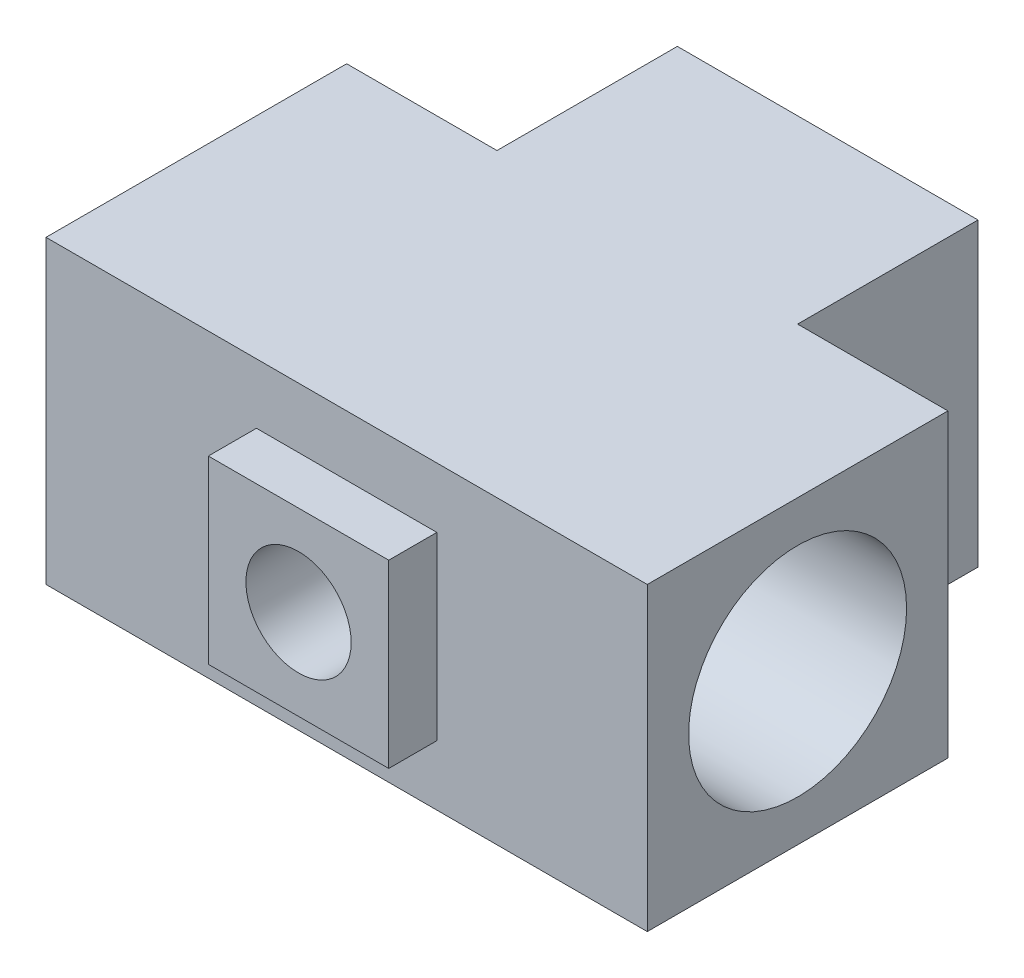
ISO-10303-21;
HEADER;
FILE_DESCRIPTION(('STEP AP214'),'2;1');
FILE_NAME('part.step','',(''),(''),'','','');
FILE_SCHEMA(('AUTOMOTIVE_DESIGN { 1 0 10303 214 1 1 1 1 }'));
ENDSEC;
DATA;
#1=APPLICATION_CONTEXT('core data for automotive mechanical design processes');
#2=APPLICATION_PROTOCOL_DEFINITION('international standard','automotive_design',2000,#1);
#3=PRODUCT_CONTEXT('',#1,'mechanical');
#4=PRODUCT('Part','Part','',(#3));
#5=PRODUCT_RELATED_PRODUCT_CATEGORY('part','',(#4));
#6=PRODUCT_DEFINITION_FORMATION('','',#4);
#7=PRODUCT_DEFINITION_CONTEXT('part definition',#1,'design');
#8=PRODUCT_DEFINITION('design','',#6,#7);
#9=PRODUCT_DEFINITION_SHAPE('','',#8);
#10=(LENGTH_UNIT() NAMED_UNIT(*) SI_UNIT(.MILLI.,.METRE.));
#11=(NAMED_UNIT(*) PLANE_ANGLE_UNIT() SI_UNIT($,.RADIAN.));
#12=(NAMED_UNIT(*) SI_UNIT($,.STERADIAN.) SOLID_ANGLE_UNIT());
#13=UNCERTAINTY_MEASURE_WITH_UNIT(LENGTH_MEASURE(1.E-05),#10,'distance_accuracy_value','');
#14=(GEOMETRIC_REPRESENTATION_CONTEXT(3) GLOBAL_UNCERTAINTY_ASSIGNED_CONTEXT((#13)) GLOBAL_UNIT_ASSIGNED_CONTEXT((#10,
#11,#12)) REPRESENTATION_CONTEXT('',''));
#15=CARTESIAN_POINT('',(0.,0.,0.));
#16=DIRECTION('',(0.,0.,1.));
#17=DIRECTION('',(1.,0.,0.));
#18=AXIS2_PLACEMENT_3D('',#15,#16,#17);
#19=CARTESIAN_POINT('',(0.,31.75,15.875));
#20=DIRECTION('',(0.,0.,-1.));
#21=DIRECTION('',(-1.,0.,0.));
#22=AXIS2_PLACEMENT_3D('',#19,#20,#21);
#23=PLANE('',#22);
#24=DIRECTION('',(1.,0.,0.));
#25=VECTOR('',#24,1.);
#26=CARTESIAN_POINT('',(0.,0.,15.875));
#27=LINE('',#26,#25);
#28=CARTESIAN_POINT('',(-31.75,0.,15.875));
#29=VERTEX_POINT('',#28);
#30=CARTESIAN_POINT('',(31.75,0.,15.875));
#31=VERTEX_POINT('',#30);
#32=EDGE_CURVE('E200',#29,#31,#27,.T.);
#33=ORIENTED_EDGE('',*,*,#32,.T.);
#34=DIRECTION('',(0.,-1.,0.));
#35=VECTOR('',#34,1.);
#36=CARTESIAN_POINT('',(31.75,31.75,15.875));
#37=LINE('',#36,#35);
#38=CARTESIAN_POINT('',(31.75,31.75,15.875));
#39=VERTEX_POINT('',#38);
#40=EDGE_CURVE('E277',#39,#31,#37,.T.);
#41=ORIENTED_EDGE('',*,*,#40,.F.);
#42=DIRECTION('',(1.,0.,0.));
#43=VECTOR('',#42,1.);
#44=CARTESIAN_POINT('',(0.,31.75,15.875));
#45=LINE('',#44,#43);
#46=CARTESIAN_POINT('',(-31.75,31.75,15.875));
#47=VERTEX_POINT('',#46);
#48=EDGE_CURVE('E201',#47,#39,#45,.T.);
#49=ORIENTED_EDGE('',*,*,#48,.F.);
#50=DIRECTION('',(0.,-1.,0.));
#51=VECTOR('',#50,1.);
#52=CARTESIAN_POINT('',(-31.75,31.75,15.875));
#53=LINE('',#52,#51);
#54=EDGE_CURVE('E229',#47,#29,#53,.T.);
#55=ORIENTED_EDGE('',*,*,#54,.T.);
#56=EDGE_LOOP('',(#33,#41,#49,#55));
#57=FACE_BOUND('',#56,.T.);
#58=DIRECTION('',(1.,0.,0.));
#59=VECTOR('',#58,1.);
#60=CARTESIAN_POINT('',(0.,6.35,15.875));
#61=LINE('',#60,#59);
#62=CARTESIAN_POINT('',(-9.525,6.35,15.875));
#63=VERTEX_POINT('',#62);
#64=CARTESIAN_POINT('',(9.525,6.35,15.875));
#65=VERTEX_POINT('',#64);
#66=EDGE_CURVE('E68',#63,#65,#61,.T.);
#67=ORIENTED_EDGE('',*,*,#66,.F.);
#68=DIRECTION('',(0.,1.,0.));
#69=VECTOR('',#68,1.);
#70=CARTESIAN_POINT('',(-9.525,0.,15.875));
#71=LINE('',#70,#69);
#72=CARTESIAN_POINT('',(-9.525,25.4,15.875));
#73=VERTEX_POINT('',#72);
#74=EDGE_CURVE('E73',#63,#73,#71,.T.);
#75=ORIENTED_EDGE('',*,*,#74,.T.);
#76=DIRECTION('',(1.,0.,0.));
#77=VECTOR('',#76,1.);
#78=CARTESIAN_POINT('',(0.,25.4,15.875));
#79=LINE('',#78,#77);
#80=CARTESIAN_POINT('',(9.525,25.4,15.875));
#81=VERTEX_POINT('',#80);
#82=EDGE_CURVE('E410',#73,#81,#79,.T.);
#83=ORIENTED_EDGE('',*,*,#82,.T.);
#84=DIRECTION('',(0.,1.,0.));
#85=VECTOR('',#84,1.);
#86=CARTESIAN_POINT('',(9.525,0.,15.875));
#87=LINE('',#86,#85);
#88=EDGE_CURVE('E396',#65,#81,#87,.T.);
#89=ORIENTED_EDGE('',*,*,#88,.F.);
#90=EDGE_LOOP('',(#67,#75,#83,#89));
#91=FACE_BOUND('',#90,.T.);
#92=ADVANCED_FACE('F47',(#57,#91),#23,.F.);
#93=CARTESIAN_POINT('',(31.75,31.75,0.));
#94=DIRECTION('',(-1.,0.,0.));
#95=DIRECTION('',(0.,0.,1.));
#96=AXIS2_PLACEMENT_3D('',#93,#94,#95);
#97=PLANE('',#96);
#98=CARTESIAN_POINT('',(31.75,15.875,0.));
#99=DIRECTION('',(1.,0.,0.));
#100=DIRECTION('',(0.,0.,-1.));
#101=AXIS2_PLACEMENT_3D('',#98,#99,#100);
#102=CIRCLE('',#101,11.509375);
#103=CARTESIAN_POINT('',(31.75,15.875,-11.509375));
#104=VERTEX_POINT('',#103);
#105=EDGE_CURVE('E192',#104,#104,#102,.T.);
#106=ORIENTED_EDGE('',*,*,#105,.F.);
#107=EDGE_LOOP('',(#106));
#108=FACE_BOUND('',#107,.T.);
#109=DIRECTION('',(0.,0.,-1.));
#110=VECTOR('',#109,1.);
#111=CARTESIAN_POINT('',(31.75,0.,0.));
#112=LINE('',#111,#110);
#113=CARTESIAN_POINT('',(31.75,0.,-15.875));
#114=VERTEX_POINT('',#113);
#115=EDGE_CURVE('E233',#31,#114,#112,.T.);
#116=ORIENTED_EDGE('',*,*,#115,.T.);
#117=DIRECTION('',(0.,-1.,0.));
#118=VECTOR('',#117,1.);
#119=CARTESIAN_POINT('',(31.75,31.75,-15.875));
#120=LINE('',#119,#118);
#121=CARTESIAN_POINT('',(31.75,31.75,-15.875));
#122=VERTEX_POINT('',#121);
#123=EDGE_CURVE('E274',#122,#114,#120,.T.);
#124=ORIENTED_EDGE('',*,*,#123,.F.);
#125=DIRECTION('',(0.,0.,-1.));
#126=VECTOR('',#125,1.);
#127=CARTESIAN_POINT('',(31.75,31.75,0.));
#128=LINE('',#127,#126);
#129=EDGE_CURVE('E205',#39,#122,#128,.T.);
#130=ORIENTED_EDGE('',*,*,#129,.F.);
#131=ORIENTED_EDGE('',*,*,#40,.T.);
#132=EDGE_LOOP('',(#116,#124,#130,#131));
#133=FACE_BOUND('',#132,.T.);
#134=ADVANCED_FACE('F344',(#108,#133),#97,.F.);
#135=CARTESIAN_POINT('',(0.,31.75,-15.875));
#136=DIRECTION('',(0.,0.,-1.));
#137=DIRECTION('',(-1.,0.,0.));
#138=AXIS2_PLACEMENT_3D('',#135,#136,#137);
#139=PLANE('',#138);
#140=DIRECTION('',(1.,0.,0.));
#141=VECTOR('',#140,1.);
#142=CARTESIAN_POINT('',(0.,0.,-15.875));
#143=LINE('',#142,#141);
#144=CARTESIAN_POINT('',(15.875,0.,-15.875));
#145=VERTEX_POINT('',#144);
#146=EDGE_CURVE('E237',#145,#114,#143,.T.);
#147=ORIENTED_EDGE('',*,*,#146,.F.);
#148=DIRECTION('',(0.,-1.,0.));
#149=VECTOR('',#148,1.);
#150=CARTESIAN_POINT('',(15.875,31.75,-15.875));
#151=LINE('',#150,#149);
#152=CARTESIAN_POINT('',(15.875,31.75,-15.875));
#153=VERTEX_POINT('',#152);
#154=EDGE_CURVE('E271',#153,#145,#151,.T.);
#155=ORIENTED_EDGE('',*,*,#154,.F.);
#156=DIRECTION('',(1.,0.,0.));
#157=VECTOR('',#156,1.);
#158=CARTESIAN_POINT('',(0.,31.75,-15.875));
#159=LINE('',#158,#157);
#160=EDGE_CURVE('E209',#153,#122,#159,.T.);
#161=ORIENTED_EDGE('',*,*,#160,.T.);
#162=ORIENTED_EDGE('',*,*,#123,.T.);
#163=EDGE_LOOP('',(#147,#155,#161,#162));
#164=FACE_BOUND('',#163,.T.);
#165=ADVANCED_FACE('F347',(#164),#139,.T.);
#166=CARTESIAN_POINT('',(15.875,31.75,0.));
#167=DIRECTION('',(-1.,0.,0.));
#168=DIRECTION('',(0.,0.,1.));
#169=AXIS2_PLACEMENT_3D('',#166,#167,#168);
#170=PLANE('',#169);
#171=DIRECTION('',(0.,0.,-1.));
#172=VECTOR('',#171,1.);
#173=CARTESIAN_POINT('',(15.875,0.,0.));
#174=LINE('',#173,#172);
#175=CARTESIAN_POINT('',(15.875,0.,-34.925));
#176=VERTEX_POINT('',#175);
#177=EDGE_CURVE('E241',#145,#176,#174,.T.);
#178=ORIENTED_EDGE('',*,*,#177,.T.);
#179=DIRECTION('',(0.,-1.,0.));
#180=VECTOR('',#179,1.);
#181=CARTESIAN_POINT('',(15.875,31.75,-34.925));
#182=LINE('',#181,#180);
#183=CARTESIAN_POINT('',(15.875,31.75,-34.925));
#184=VERTEX_POINT('',#183);
#185=EDGE_CURVE('E268',#184,#176,#182,.T.);
#186=ORIENTED_EDGE('',*,*,#185,.F.);
#187=DIRECTION('',(0.,0.,-1.));
#188=VECTOR('',#187,1.);
#189=CARTESIAN_POINT('',(15.875,31.75,0.));
#190=LINE('',#189,#188);
#191=EDGE_CURVE('E213',#153,#184,#190,.T.);
#192=ORIENTED_EDGE('',*,*,#191,.F.);
#193=ORIENTED_EDGE('',*,*,#154,.T.);
#194=EDGE_LOOP('',(#178,#186,#192,#193));
#195=FACE_BOUND('',#194,.T.);
#196=ADVANCED_FACE('F352',(#195),#170,.F.);
#197=CARTESIAN_POINT('',(0.,31.75,-34.925));
#198=DIRECTION('',(0.,0.,-1.));
#199=DIRECTION('',(-1.,0.,0.));
#200=AXIS2_PLACEMENT_3D('',#197,#198,#199);
#201=PLANE('',#200);
#202=CARTESIAN_POINT('',(0.,15.875,-34.925));
#203=DIRECTION('',(0.,0.,-1.));
#204=DIRECTION('',(-1.,0.,0.));
#205=AXIS2_PLACEMENT_3D('',#202,#203,#204);
#206=CIRCLE('',#205,11.509375);
#207=CARTESIAN_POINT('',(-11.509375,15.875,-34.925));
#208=VERTEX_POINT('',#207);
#209=EDGE_CURVE('E178',#208,#208,#206,.T.);
#210=ORIENTED_EDGE('',*,*,#209,.F.);
#211=EDGE_LOOP('',(#210));
#212=FACE_BOUND('',#211,.T.);
#213=DIRECTION('',(1.,0.,0.));
#214=VECTOR('',#213,1.);
#215=CARTESIAN_POINT('',(0.,0.,-34.925));
#216=LINE('',#215,#214);
#217=CARTESIAN_POINT('',(-15.875,0.,-34.925));
#218=VERTEX_POINT('',#217);
#219=EDGE_CURVE('E246',#218,#176,#216,.T.);
#220=ORIENTED_EDGE('',*,*,#219,.F.);
#221=DIRECTION('',(0.,-1.,0.));
#222=VECTOR('',#221,1.);
#223=CARTESIAN_POINT('',(-15.875,31.75,-34.925));
#224=LINE('',#223,#222);
#225=CARTESIAN_POINT('',(-15.875,31.75,-34.925));
#226=VERTEX_POINT('',#225);
#227=EDGE_CURVE('E265',#226,#218,#224,.T.);
#228=ORIENTED_EDGE('',*,*,#227,.F.);
#229=DIRECTION('',(1.,0.,0.));
#230=VECTOR('',#229,1.);
#231=CARTESIAN_POINT('',(0.,31.75,-34.925));
#232=LINE('',#231,#230);
#233=EDGE_CURVE('E217',#226,#184,#232,.T.);
#234=ORIENTED_EDGE('',*,*,#233,.T.);
#235=ORIENTED_EDGE('',*,*,#185,.T.);
#236=EDGE_LOOP('',(#220,#228,#234,#235));
#237=FACE_BOUND('',#236,.T.);
#238=ADVANCED_FACE('F359',(#212,#237),#201,.T.);
#239=CARTESIAN_POINT('',(-15.875,31.75,0.));
#240=DIRECTION('',(-1.,0.,0.));
#241=DIRECTION('',(0.,0.,1.));
#242=AXIS2_PLACEMENT_3D('',#239,#240,#241);
#243=PLANE('',#242);
#244=DIRECTION('',(0.,0.,-1.));
#245=VECTOR('',#244,1.);
#246=CARTESIAN_POINT('',(-15.875,0.,0.));
#247=LINE('',#246,#245);
#248=CARTESIAN_POINT('',(-15.875,0.,-15.875));
#249=VERTEX_POINT('',#248);
#250=EDGE_CURVE('E250',#249,#218,#247,.T.);
#251=ORIENTED_EDGE('',*,*,#250,.F.);
#252=DIRECTION('',(0.,-1.,0.));
#253=VECTOR('',#252,1.);
#254=CARTESIAN_POINT('',(-15.875,31.75,-15.875));
#255=LINE('',#254,#253);
#256=CARTESIAN_POINT('',(-15.875,31.75,-15.875));
#257=VERTEX_POINT('',#256);
#258=EDGE_CURVE('E262',#257,#249,#255,.T.);
#259=ORIENTED_EDGE('',*,*,#258,.F.);
#260=DIRECTION('',(0.,0.,-1.));
#261=VECTOR('',#260,1.);
#262=CARTESIAN_POINT('',(-15.875,31.75,0.));
#263=LINE('',#262,#261);
#264=EDGE_CURVE('E221',#257,#226,#263,.T.);
#265=ORIENTED_EDGE('',*,*,#264,.T.);
#266=ORIENTED_EDGE('',*,*,#227,.T.);
#267=EDGE_LOOP('',(#251,#259,#265,#266));
#268=FACE_BOUND('',#267,.T.);
#269=ADVANCED_FACE('F355',(#268),#243,.T.);
#270=CARTESIAN_POINT('',(-31.75,0.,-15.875));
#271=VERTEX_POINT('',#270);
#272=EDGE_CURVE('E242',#271,#249,#143,.T.);
#273=ORIENTED_EDGE('',*,*,#272,.F.);
#274=DIRECTION('',(0.,-1.,0.));
#275=VECTOR('',#274,1.);
#276=CARTESIAN_POINT('',(-31.75,31.75,-15.875));
#277=LINE('',#276,#275);
#278=CARTESIAN_POINT('',(-31.75,31.75,-15.875));
#279=VERTEX_POINT('',#278);
#280=EDGE_CURVE('E259',#279,#271,#277,.T.);
#281=ORIENTED_EDGE('',*,*,#280,.F.);
#282=EDGE_CURVE('E214',#279,#257,#159,.T.);
#283=ORIENTED_EDGE('',*,*,#282,.T.);
#284=ORIENTED_EDGE('',*,*,#258,.T.);
#285=EDGE_LOOP('',(#273,#281,#283,#284));
#286=FACE_BOUND('',#285,.T.);
#287=ADVANCED_FACE('F327',(#286),#139,.T.);
#288=CARTESIAN_POINT('',(-31.75,31.75,0.));
#289=DIRECTION('',(-1.,0.,0.));
#290=DIRECTION('',(0.,0.,1.));
#291=AXIS2_PLACEMENT_3D('',#288,#289,#290);
#292=PLANE('',#291);
#293=CARTESIAN_POINT('',(-31.75,15.875,0.));
#294=DIRECTION('',(1.,0.,0.));
#295=DIRECTION('',(0.,0.,-1.));
#296=AXIS2_PLACEMENT_3D('',#293,#294,#295);
#297=CIRCLE('',#296,11.509375);
#298=CARTESIAN_POINT('',(-31.75,15.875,-11.509375));
#299=VERTEX_POINT('',#298);
#300=EDGE_CURVE('E196',#299,#299,#297,.T.);
#301=ORIENTED_EDGE('',*,*,#300,.T.);
#302=EDGE_LOOP('',(#301));
#303=FACE_BOUND('',#302,.T.);
#304=DIRECTION('',(0.,0.,-1.));
#305=VECTOR('',#304,1.);
#306=CARTESIAN_POINT('',(-31.75,0.,0.));
#307=LINE('',#306,#305);
#308=EDGE_CURVE('E206',#29,#271,#307,.T.);
#309=ORIENTED_EDGE('',*,*,#308,.F.);
#310=ORIENTED_EDGE('',*,*,#54,.F.);
#311=DIRECTION('',(0.,0.,-1.));
#312=VECTOR('',#311,1.);
#313=CARTESIAN_POINT('',(-31.75,31.75,0.));
#314=LINE('',#313,#312);
#315=EDGE_CURVE('E225',#47,#279,#314,.T.);
#316=ORIENTED_EDGE('',*,*,#315,.T.);
#317=ORIENTED_EDGE('',*,*,#280,.T.);
#318=EDGE_LOOP('',(#309,#310,#316,#317));
#319=FACE_BOUND('',#318,.T.);
#320=ADVANCED_FACE('F336',(#303,#319),#292,.T.);
#321=CARTESIAN_POINT('',(0.,31.75,0.));
#322=DIRECTION('',(0.,1.,0.));
#323=DIRECTION('',(0.,0.,1.));
#324=AXIS2_PLACEMENT_3D('',#321,#322,#323);
#325=PLANE('',#324);
#326=ORIENTED_EDGE('',*,*,#48,.T.);
#327=ORIENTED_EDGE('',*,*,#129,.T.);
#328=ORIENTED_EDGE('',*,*,#160,.F.);
#329=ORIENTED_EDGE('',*,*,#191,.T.);
#330=ORIENTED_EDGE('',*,*,#233,.F.);
#331=ORIENTED_EDGE('',*,*,#264,.F.);
#332=ORIENTED_EDGE('',*,*,#282,.F.);
#333=ORIENTED_EDGE('',*,*,#315,.F.);
#334=EDGE_LOOP('',(#326,#327,#328,#329,#330,#331,#332,#333));
#335=FACE_BOUND('',#334,.T.);
#336=ADVANCED_FACE('F332',(#335),#325,.T.);
#337=CARTESIAN_POINT('',(0.,0.,0.));
#338=DIRECTION('',(0.,1.,0.));
#339=DIRECTION('',(0.,0.,1.));
#340=AXIS2_PLACEMENT_3D('',#337,#338,#339);
#341=PLANE('',#340);
#342=ORIENTED_EDGE('',*,*,#32,.F.);
#343=ORIENTED_EDGE('',*,*,#308,.T.);
#344=ORIENTED_EDGE('',*,*,#272,.T.);
#345=ORIENTED_EDGE('',*,*,#250,.T.);
#346=ORIENTED_EDGE('',*,*,#219,.T.);
#347=ORIENTED_EDGE('',*,*,#177,.F.);
#348=ORIENTED_EDGE('',*,*,#146,.T.);
#349=ORIENTED_EDGE('',*,*,#115,.F.);
#350=EDGE_LOOP('',(#342,#343,#344,#345,#346,#347,#348,#349));
#351=FACE_BOUND('',#350,.T.);
#352=ADVANCED_FACE('F358',(#351),#341,.F.);
#353=CARTESIAN_POINT('',(31.75,15.875,0.));
#354=DIRECTION('',(1.,0.,0.));
#355=DIRECTION('',(0.,0.,-1.));
#356=AXIS2_PLACEMENT_3D('',#353,#354,#355);
#357=CYLINDRICAL_SURFACE('',#356,11.509375);
#358=CARTESIAN_POINT('',(5.55625,15.875,11.509375));
#359=CARTESIAN_POINT('',(5.55624917670931,16.0217161827962,11.5093742745244));
#360=CARTESIAN_POINT('',(5.55043176712709,16.1684514863056,11.5065627281438));
#361=CARTESIAN_POINT('',(5.52722532965593,16.4608490918241,11.4953867994236));
#362=CARTESIAN_POINT('',(5.50983075529338,16.6065108456735,11.4870197555197));
#363=CARTESIAN_POINT('',(5.46363405768655,16.8958379508244,11.4649327836274));
#364=CARTESIAN_POINT('',(5.43481396879573,17.0394997873948,11.4512044259401));
#365=CARTESIAN_POINT('',(5.36607781282107,17.3236196089221,11.4187421982216));
#366=CARTESIAN_POINT('',(5.32615720917637,17.464076258534,11.4000062818219));
#367=CARTESIAN_POINT('',(5.23582668542856,17.7402185894981,11.3580845669973));
#368=CARTESIAN_POINT('',(5.18546202443527,17.8759219967391,11.3349180013025));
#369=CARTESIAN_POINT('',(5.0746132703954,18.1423928013823,11.2846385897472));
#370=CARTESIAN_POINT('',(5.01412537467707,18.2731583212179,11.2575242614565));
#371=CARTESIAN_POINT('',(4.81827856523361,18.6567962075089,11.171204198503));
#372=CARTESIAN_POINT('',(4.66843156311467,18.9013275978551,11.1069709761259));
#373=CARTESIAN_POINT('',(4.32480364962457,19.3762803882592,10.9668460296091));
#374=CARTESIAN_POINT('',(4.12899135252334,19.6050810049142,10.8904962139281));
#375=CARTESIAN_POINT('',(3.70310804289293,20.0281845102496,10.7362690637281));
#376=CARTESIAN_POINT('',(3.47301301976507,20.2224630098797,10.6583906921144));
#377=CARTESIAN_POINT('',(3.09706550322224,20.490856906311,10.5437185326314));
#378=CARTESIAN_POINT('',(2.96164682087579,20.5789081286492,10.5046244939838));
#379=CARTESIAN_POINT('',(2.68303969055155,20.7431956350958,10.4295026937569));
#380=CARTESIAN_POINT('',(2.53985455771173,20.8194369075664,10.3934736404844));
#381=CARTESIAN_POINT('',(2.24653350940521,20.9594287072871,10.3257132657496));
#382=CARTESIAN_POINT('',(2.0963979044515,21.023179791873,10.2939817525424));
#383=CARTESIAN_POINT('',(1.79023246616458,21.1374763177278,10.2360228975961));
#384=CARTESIAN_POINT('',(1.63420607738184,21.188029343568,10.2097923962852));
#385=CARTESIAN_POINT('',(1.32648387367507,21.2728090952795,10.1652118787826));
#386=CARTESIAN_POINT('',(1.17505356132178,21.3078063968844,10.1464959430813));
#387=CARTESIAN_POINT('',(0.869208860627859,21.3650433875042,10.115641263073));
#388=CARTESIAN_POINT('',(0.71479604772813,21.3872896312438,10.1034991396535));
#389=CARTESIAN_POINT('',(0.40433100232894,21.4187137561491,10.0862913659061));
#390=CARTESIAN_POINT('',(0.248279649045267,21.4278983178002,10.0812220981435));
#391=CARTESIAN_POINT('',(-0.0641021623082889,21.4330753075958,10.0783690850181));
#392=CARTESIAN_POINT('',(-0.220432595712277,21.4290688489978,10.0805847248447));
#393=CARTESIAN_POINT('',(-0.514787582262235,21.4090960170049,10.0915608134673));
#394=CARTESIAN_POINT('',(-0.652935232069558,21.3944928752436,10.0995749824762));
#395=CARTESIAN_POINT('',(-0.927379883061346,21.3550644062661,10.1210232079932));
#396=CARTESIAN_POINT('',(-1.06367628328813,21.330235837873,10.134458982973));
#397=CARTESIAN_POINT('',(-1.33345991658716,21.2706348318495,10.1663158118991));
#398=CARTESIAN_POINT('',(-1.46694757494182,21.2358639114314,10.1847361051804));
#399=CARTESIAN_POINT('',(-1.73036735965916,21.1567313303141,10.225996808665));
#400=CARTESIAN_POINT('',(-1.86029807252418,21.112365917434,10.248838947781));
#401=CARTESIAN_POINT('',(-2.24952315162245,20.96320273266,10.3241730035307));
#402=CARTESIAN_POINT('',(-2.50218142559267,20.8436861921535,10.3827132068056));
#403=CARTESIAN_POINT('',(-2.98489712264919,20.5696271842136,10.5094677729022));
#404=CARTESIAN_POINT('',(-3.21494442638983,20.4150691356525,10.5776864341633));
#405=CARTESIAN_POINT('',(-3.67443472273407,20.0541711800927,10.725791278955));
#406=CARTESIAN_POINT('',(-3.90065010750817,19.8438863118393,10.8061081019085));
#407=CARTESIAN_POINT('',(-4.31596509645506,19.3877505918141,10.9628597354545));
#408=CARTESIAN_POINT('',(-4.50504920376075,19.1418849643302,11.0392929153721));
#409=CARTESIAN_POINT('',(-4.76026535090936,18.7451814958855,11.1466447726395));
#410=CARTESIAN_POINT('',(-4.84190294707575,18.6052486797592,11.1818256881973));
#411=CARTESIAN_POINT('',(-4.99297394488215,18.3180339143438,11.2480650561521));
#412=CARTESIAN_POINT('',(-5.06241245737349,18.1707550760613,11.2791252336059));
#413=CARTESIAN_POINT('',(-5.1883453158768,17.8698883876937,11.3362065187612));
#414=CARTESIAN_POINT('',(-5.24484440516823,17.7163028739094,11.3622294724437));
#415=CARTESIAN_POINT('',(-5.34425784976348,17.4039448450254,11.408459622944));
#416=CARTESIAN_POINT('',(-5.38717364828769,17.2451728829629,11.4286674375976));
#417=CARTESIAN_POINT('',(-5.45602095233257,16.9364840034257,11.4612879518407));
#418=CARTESIAN_POINT('',(-5.48302580699813,16.7868575232727,11.4741900903213));
#419=CARTESIAN_POINT('',(-5.52470046509021,16.4855151543708,11.4941627673432));
#420=CARTESIAN_POINT('',(-5.53937126096037,16.3337994347284,11.5012337750778));
#421=CARTESIAN_POINT('',(-5.55618807382354,16.0295677480296,11.5093427554344));
#422=CARTESIAN_POINT('',(-5.55833844918365,15.8770520779428,11.5103828274287));
#423=CARTESIAN_POINT('',(-5.55009766154914,15.5724426409943,11.5064055701472));
#424=CARTESIAN_POINT('',(-5.53970698297379,15.4203488580639,11.5013884748396));
#425=CARTESIAN_POINT('',(-5.50770799569872,15.1286532269732,11.4860118003834));
#426=CARTESIAN_POINT('',(-5.48695394022252,14.9889350720954,11.4760594152334));
#427=CARTESIAN_POINT('',(-5.43496904456927,14.7118566496924,11.4512953602001));
#428=CARTESIAN_POINT('',(-5.40373486504144,14.5744971484032,11.4364821415108));
#429=CARTESIAN_POINT('',(-5.33111429815479,14.3031049507264,11.4023484300071));
#430=CARTESIAN_POINT('',(-5.28973097011656,14.1690712651997,11.3830292955246));
#431=CARTESIAN_POINT('',(-5.19719866461974,13.9050665082899,11.3403262772334));
#432=CARTESIAN_POINT('',(-5.14604595046922,13.7750970136272,11.3169408384118));
#433=CARTESIAN_POINT('',(-4.97526526228489,13.3848817770465,11.2399484532559));
#434=CARTESIAN_POINT('',(-4.84043485852495,13.1322355665106,11.1805371343703));
#435=CARTESIAN_POINT('',(-4.53518458376599,12.6524131041097,11.0518139622956));
#436=CARTESIAN_POINT('',(-4.36474920052133,12.4252480202878,10.9824977979732));
#437=CARTESIAN_POINT('',(-3.97478995091778,11.9803369483628,10.83315813575));
#438=CARTESIAN_POINT('',(-3.7521764329486,11.765427289037,10.7527381857527));
#439=CARTESIAN_POINT('',(-3.27341673003243,11.3747703395995,10.5951927396217));
#440=CARTESIAN_POINT('',(-3.01725132991948,11.1990456477678,10.5180691651496));
#441=CARTESIAN_POINT('',(-2.6066293865917,10.965458575265,10.4100860394683));
#442=CARTESIAN_POINT('',(-2.46229626188337,10.891482193332,10.3747742376043));
#443=CARTESIAN_POINT('',(-2.16687413852488,10.7561201860935,10.3086590819563));
#444=CARTESIAN_POINT('',(-2.01578822507776,10.6947288811331,10.2778536962287));
#445=CARTESIAN_POINT('',(-1.7079757805328,10.5852549829649,10.221941758035));
#446=CARTESIAN_POINT('',(-1.55125357586345,10.5371624180251,10.1968309381948));
#447=CARTESIAN_POINT('',(-1.23329265055951,10.4548657207494,10.1533261373838));
#448=CARTESIAN_POINT('',(-1.0720545732824,10.4206596207178,10.134931204817));
#449=CARTESIAN_POINT('',(-0.761717566487486,10.3691774186428,10.1070471653463));
#450=CARTESIAN_POINT('',(-0.612890756313448,10.3506188374852,10.0968869227534));
#451=CARTESIAN_POINT('',(-0.313925698362231,10.3255982718127,10.0831572812686));
#452=CARTESIAN_POINT('',(-0.163787570158543,10.3191351956945,10.0795872876159));
#453=CARTESIAN_POINT('',(0.136483530582645,10.3183983480878,10.0791810483278));
#454=CARTESIAN_POINT('',(0.286616492485649,10.3241211170063,10.0823428915065));
#455=CARTESIAN_POINT('',(0.58563684120493,10.3476646599421,10.0952689889765));
#456=CARTESIAN_POINT('',(0.734524266860923,10.3654850552831,10.1050330366076));
#457=CARTESIAN_POINT('',(1.01749931869986,10.4109910872922,10.1297052039949));
#458=CARTESIAN_POINT('',(1.15178415635671,10.4377281014503,10.1441153857669));
#459=CARTESIAN_POINT('',(1.41746883751014,10.5008614763396,10.1777018617631));
#460=CARTESIAN_POINT('',(1.54886776509318,10.5372608570301,10.1968796459757));
#461=CARTESIAN_POINT('',(1.93754157022929,10.6604433169916,10.2607380055822));
#462=CARTESIAN_POINT('',(2.18947663802037,10.7612406732841,10.3117607695226));
#463=CARTESIAN_POINT('',(2.69007546576374,11.0048738554934,10.4291395000461));
#464=CARTESIAN_POINT('',(2.93738590514495,11.1500762478461,10.4962944848735));
#465=CARTESIAN_POINT('',(3.40571736098759,11.4756321473774,10.6368584817885));
#466=CARTESIAN_POINT('',(3.62672524243684,11.6560030994548,10.7102705874241));
#467=CARTESIAN_POINT('',(4.06154830948552,12.0703407406444,10.8648141713499));
#468=CARTESIAN_POINT('',(4.27188138728121,12.30802461839,10.9459039654802));
#469=CARTESIAN_POINT('',(4.55553399438264,12.6899895916608,11.0607070482151));
#470=CARTESIAN_POINT('',(4.64483792981559,12.8216710750929,11.0978641551184));
#471=CARTESIAN_POINT('',(4.81215032344455,13.0928315629359,11.1689232679138));
#472=CARTESIAN_POINT('',(4.89016397304004,13.2323069424704,11.2028267674195));
#473=CARTESIAN_POINT('',(5.03425029400513,13.5183273248093,11.2664676998002));
#474=CARTESIAN_POINT('',(5.10031478376494,13.6648770851237,11.2962022750971));
#475=CARTESIAN_POINT('',(5.21972533720667,13.9639060841525,11.3506170029584));
#476=CARTESIAN_POINT('',(5.27307762099158,14.1163823803467,11.3752996266138));
#477=CARTESIAN_POINT('',(5.36636120732754,14.4258149773538,11.4188411531494));
#478=CARTESIAN_POINT('',(5.40632276114929,14.5827602990886,11.4377131749363));
#479=CARTESIAN_POINT('',(5.47244674032604,14.9000761842849,11.4691159636703));
#480=CARTESIAN_POINT('',(5.49861796836467,15.0604444945748,11.4816507755972));
#481=CARTESIAN_POINT('',(5.53053809682022,15.330062331827,11.4969792925322));
#482=CARTESIAN_POINT('',(5.54017354912781,15.438764603652,11.5016212304839));
#483=CARTESIAN_POINT('',(5.55302988750243,15.656641046,11.5078193928603));
#484=CARTESIAN_POINT('',(5.55625061268501,15.7658152282898,11.509375539892));
#485=CARTESIAN_POINT('',(5.55625,15.875,11.509375));
#486=B_SPLINE_CURVE_WITH_KNOTS('',3,(#358,#359,#360,#361,#362,#363,#364,#365,#366,#367,#368,
#369,#370,#371,#372,#373,#374,#375,#376,#377,#378,#379,#380,#381,#382,#383,#384,#385,#386,#387,
#388,#389,#390,#391,#392,#393,#394,#395,#396,#397,#398,#399,#400,#401,#402,#403,#404,#405,#406,
#407,#408,#409,#410,#411,#412,#413,#414,#415,#416,#417,#418,#419,#420,#421,#422,#423,#424,#425,
#426,#427,#428,#429,#430,#431,#432,#433,#434,#435,#436,#437,#438,#439,#440,#441,#442,#443,#444,
#445,#446,#447,#448,#449,#450,#451,#452,#453,#454,#455,#456,#457,#458,#459,#460,#461,#462,#463,
#464,#465,#466,#467,#468,#469,#470,#471,#472,#473,#474,#475,#476,#477,#478,#479,#480,#481,#482,
#483,#484,#485),.UNSPECIFIED.,.T.,.F.,(4,2,2,2,2,2,2,2,2,2,2,2,2,2,2,2,2,2,2,2,2,2,2,2,2,2,2,2,
2,2,2,2,2,2,2,2,2,2,2,2,2,2,2,2,2,2,2,2,2,2,2,2,2,2,2,2,2,2,2,2,2,2,2,4),(0.,0.440040362554435,
0.880291694793109,1.32123804799024,1.76236487276905,2.2016186012331,2.6410377019674,
3.5188724778228,4.44720306001579,5.37618690039855,5.87423862157219,6.37207939544333,
6.86989794965314,7.36742978798151,7.8364030055191,8.30513492906855,8.77362703018528,
9.24207959387839,9.65903291521381,10.0761185010477,10.4931404731679,10.9103258286747,
11.7632747568597,12.6166036932768,13.5698940930991,14.5235815103237,15.0203733968855,
15.5169566517119,16.0133575787172,16.5097057455598,16.9668702497747,17.4239979653343,
17.8809665448997,18.3379174738513,18.7622297607783,19.186677377713,19.6109972076969,
20.0354796619695,20.9089138427864,21.7827293547615,22.7377353085697,23.6932906055866,
24.1906889846946,24.6878623909293,25.1846619867895,25.6813911621445,26.1317439144035,
26.5820560209659,27.0322402998047,27.4824104877662,27.8949694997984,28.3076576087051,
29.1324810406994,30.0126390208786,30.8932347076183,31.8709593379778,32.3606357240867,
32.8500862312346,33.3398706076821,33.8294148374232,34.3178455520473,34.8059641112104,
35.133429702592,35.4609035068655),.UNSPECIFIED.);
#487=CARTESIAN_POINT('',(5.55625,15.875,11.509375));
#488=VERTEX_POINT('',#487);
#489=EDGE_CURVE('E50',#488,#488,#486,.T.);
#490=ORIENTED_EDGE('',*,*,#489,.T.);
#491=EDGE_LOOP('',(#490));
#492=FACE_BOUND('',#491,.T.);
#493=CARTESIAN_POINT('',(0.,15.875,0.));
#494=DIRECTION('',(0.707106781186547,0.,0.707106781186548));
#495=DIRECTION('',(0.707106781186548,0.,-0.707106781186547));
#496=AXIS2_PLACEMENT_3D('',#493,#494,#495);
#497=ELLIPSE('',#496,16.2767142194378,11.509375);
#498=CARTESIAN_POINT('',(0.635000000000084,27.366844407693,-0.634999999999998));
#499=VERTEX_POINT('',#498);
#500=CARTESIAN_POINT('',(0.635000000000063,4.38315559230701,-0.634999999999997));
#501=VERTEX_POINT('',#500);
#502=EDGE_CURVE('E290',#499,#501,#497,.F.);
#503=ORIENTED_EDGE('',*,*,#502,.T.);
#504=CARTESIAN_POINT('',(8.28034969379421,4.56652968213701,-2.14107728973908));
#505=CARTESIAN_POINT('',(8.04697140914456,4.5521618128542,-2.06520435411905));
#506=CARTESIAN_POINT('',(7.81296621873668,4.53891465222788,-1.99104337402636));
#507=CARTESIAN_POINT('',(7.34368387637691,4.51450015895452,-1.84664764303146));
#508=CARTESIAN_POINT('',(7.10840694411293,4.50333247820184,-1.77641223636705));
#509=CARTESIAN_POINT('',(6.39756556981062,4.47257172585171,-1.57145728895622));
#510=CARTESIAN_POINT('',(5.91991429497284,4.45589708367954,-1.44345267730067));
#511=CARTESIAN_POINT('',(4.87815121075081,4.42653441299408,-1.19047347828715));
#512=CARTESIAN_POINT('',(4.3129790058956,4.41498465291577,-1.06961061982872));
#513=CARTESIAN_POINT('',(3.4599019065689,4.4021688213812,-0.917843798097539));
#514=CARTESIAN_POINT('',(3.17462833604087,4.39864822227179,-0.872173089137612));
#515=CARTESIAN_POINT('',(2.60255172971281,4.39281516310672,-0.791692314720582));
#516=CARTESIAN_POINT('',(2.31574885599602,4.39050257749333,-0.756881120705808));
#517=CARTESIAN_POINT('',(1.74211547845257,4.38684106256468,-0.699110401404895));
#518=CARTESIAN_POINT('',(1.45528981956836,4.38548825683195,-0.676103306535483));
#519=CARTESIAN_POINT('',(0.880905866775595,4.38355191069536,-0.64235668436474));
#520=CARTESIAN_POINT('',(0.593347566439158,4.38296837706421,-0.631617265068697));
#521=CARTESIAN_POINT('',(0.0180880503800221,4.38248260803785,-0.622718472946413));
#522=CARTESIAN_POINT('',(-0.26961312783096,4.38258024327934,-0.624556711449151));
#523=CARTESIAN_POINT('',(-0.844639089428089,4.38347215075377,-0.640751166071572));
#524=CARTESIAN_POINT('',(-1.13196389356968,4.38426638279996,-0.655106660069188));
#525=CARTESIAN_POINT('',(-1.7574665511485,4.38688234221665,-0.699611698435329));
#526=CARTESIAN_POINT('',(-2.09547517555065,4.38886347505139,-0.73214176795315));
#527=CARTESIAN_POINT('',(-2.76952939209206,4.39429585532765,-0.812876426961357));
#528=CARTESIAN_POINT('',(-3.10557525051311,4.39774689842355,-0.861078837476568));
#529=CARTESIAN_POINT('',(-3.7761196440505,4.40658468161239,-0.971720194483411));
#530=CARTESIAN_POINT('',(-4.11061234291217,4.41197616037186,-1.03419385463487));
#531=CARTESIAN_POINT('',(-4.77696553797187,4.42520162739702,-1.17157808128596));
#532=CARTESIAN_POINT('',(-5.10882598094834,4.43303566492035,-1.24648889858412));
#533=CARTESIAN_POINT('',(-5.99928009376495,4.45813480577238,-1.46272749762656));
#534=CARTESIAN_POINT('',(-6.55537011307646,4.47817178733469,-1.61406560229276));
#535=CARTESIAN_POINT('',(-7.66026598058845,4.52910386137241,-1.93999414007755));
#536=CARTESIAN_POINT('',(-8.20906935583847,4.56000254705349,-2.11459225605278));
#537=CARTESIAN_POINT('',(-9.30069112954593,4.63472488602924,-2.48133323380816));
#538=CARTESIAN_POINT('',(-9.84350041992903,4.67856598013655,-2.67349952716341));
#539=CARTESIAN_POINT('',(-10.9229281587361,4.78089968935497,-3.07062189266619));
#540=CARTESIAN_POINT('',(-11.4595473568854,4.83939051022459,-3.27557639625699));
#541=CARTESIAN_POINT('',(-12.5270585442983,4.97261307742757,-3.69487301346262));
#542=CARTESIAN_POINT('',(-13.0579506333974,5.0473445401705,-3.9092149631038));
#543=CARTESIAN_POINT('',(-14.1141766392889,5.21460809124705,-4.34467332455605));
#544=CARTESIAN_POINT('',(-14.6395101650067,5.30714142336637,-4.56579020881195));
#545=CARTESIAN_POINT('',(-15.6838273209991,5.51153334405864,-5.01243904278897));
#546=CARTESIAN_POINT('',(-16.2028171980662,5.6233709472292,-5.23796596477638));
#547=CARTESIAN_POINT('',(-17.2344473335713,5.86826155580354,-5.69187382920349));
#548=CARTESIAN_POINT('',(-17.7470886655064,6.00131092015772,-5.92025427563938));
#549=CARTESIAN_POINT('',(-18.5095808011961,6.21814262917905,-6.2633060056328));
#550=CARTESIAN_POINT('',(-18.7621659623353,6.2931284401575,-6.37750704366335));
#551=CARTESIAN_POINT('',(-19.2653781691589,6.44922468313111,-6.60602913796311));
#552=CARTESIAN_POINT('',(-19.5160052793977,6.5303349122638,-6.72035019013344));
#553=CARTESIAN_POINT('',(-20.0148470734699,6.69893651555078,-6.94879260334305));
#554=CARTESIAN_POINT('',(-20.2630640417125,6.78642100373313,-7.06291404740058));
#555=CARTESIAN_POINT('',(-20.7571309922986,6.96826047538888,-7.29087858327463));
#556=CARTESIAN_POINT('',(-21.002980719136,7.06261619129609,-7.40472164407635));
#557=CARTESIAN_POINT('',(-21.2475078731793,7.16060490621742,-7.51831304483147));
#558=B_SPLINE_CURVE_WITH_KNOTS('',3,(#504,#505,#506,#507,#508,#509,#510,#511,#512,#513,#514,
#515,#516,#517,#518,#519,#520,#521,#522,#523,#524,#525,#526,#527,#528,#529,#530,#531,#532,#533,
#534,#535,#536,#537,#538,#539,#540,#541,#542,#543,#544,#545,#546,#547,#548,#549,#550,#551,#552,
#553,#554,#555,#556,#557),.UNSPECIFIED.,.F.,.F.,(4,2,2,2,2,2,2,2,2,2,2,2,2,2,2,2,2,2,2,2,2,2,2,
2,2,2,4),(0.,0.737456273013513,1.47478898439324,2.95869808337371,4.69157761778764,
5.55818638123562,6.42470505373229,7.28770374131464,8.15071002672611,9.01355241986817,
9.87634503881554,10.8946607778596,11.9128349977418,12.9335127249319,13.9542110368558,
15.6833637500627,17.4130890306536,19.1451559623851,20.8770108609487,22.608835520682,
24.3407812239688,26.0708558764195,27.8006338765229,28.6620714129396,29.5234804279949,
30.3839722980574,31.2445560263015),.UNSPECIFIED.);
#559=CARTESIAN_POINT('',(-0.635000000000063,4.38315559230701,-0.634999999999997));
#560=VERTEX_POINT('',#559);
#561=EDGE_CURVE('E11',#501,#560,#558,.T.);
#562=ORIENTED_EDGE('',*,*,#561,.T.);
#563=CARTESIAN_POINT('',(0.,15.875,0.));
#564=DIRECTION('',(0.707106781186548,0.,-0.707106781186547));
#565=DIRECTION('',(0.707106781186547,0.,0.707106781186548));
#566=AXIS2_PLACEMENT_3D('',#563,#564,#565);
#567=ELLIPSE('',#566,16.2767142194378,11.509375);
#568=CARTESIAN_POINT('',(-0.635000000000084,27.366844407693,-0.634999999999997));
#569=VERTEX_POINT('',#568);
#570=EDGE_CURVE('E61',#560,#569,#567,.T.);
#571=ORIENTED_EDGE('',*,*,#570,.T.);
#572=CARTESIAN_POINT('',(-21.2475078731793,24.5893950937826,-7.51831304483147));
#573=CARTESIAN_POINT('',(-20.9802396746318,24.6964926597554,-7.39415817299098));
#574=CARTESIAN_POINT('',(-20.7113957406666,24.7992540619152,-7.26970388601279));
#575=CARTESIAN_POINT('',(-20.1709076570936,24.9966129016988,-7.02048635381409));
#576=CARTESIAN_POINT('',(-19.8992638313608,25.0912112719693,-6.89572314556859));
#577=CARTESIAN_POINT('',(-19.3536098533136,25.2727287969435,-6.6462149248465));
#578=CARTESIAN_POINT('',(-19.0796010246237,25.3596519755412,-6.52146993747926));
#579=CARTESIAN_POINT('',(-18.5293100773757,25.5263130347565,-6.27218844035661));
#580=CARTESIAN_POINT('',(-18.2530278849994,25.6060506810405,-6.14765193753016));
#581=CARTESIAN_POINT('',(-17.4211607097519,25.835062656698,-5.77477306013128));
#582=CARTESIAN_POINT('',(-16.8624466795732,25.9741717185318,-5.52711160160272));
#583=CARTESIAN_POINT('',(-15.7377619461542,26.2279637254837,-5.03570087081765));
#584=CARTESIAN_POINT('',(-15.1717902124708,26.3426431604666,-4.79195216540541));
#585=CARTESIAN_POINT('',(-14.0373982494132,26.549041254077,-4.31255418779289));
#586=CARTESIAN_POINT('',(-13.4690276774725,26.6409246119271,-4.07685810212517));
#587=CARTESIAN_POINT('',(-12.3257610099271,26.8048215624444,-3.61452990681549));
#588=CARTESIAN_POINT('',(-11.7508647687869,26.8768347110557,-3.387897999835));
#589=CARTESIAN_POINT('',(-10.5945945215765,27.0028942646459,-2.94755360804077));
#590=CARTESIAN_POINT('',(-10.0132246112803,27.0569514291152,-2.73383344936354));
#591=CARTESIAN_POINT('',(-8.84307512356434,27.1492191949726,-2.32415552837324));
#592=CARTESIAN_POINT('',(-8.25429721618361,27.1874333042883,-2.12819384154281));
#593=CARTESIAN_POINT('',(-7.4780409837815,27.2286647537216,-1.88768656200687));
#594=CARTESIAN_POINT('',(-7.29428615563277,27.2377611947704,-1.83204894332632));
#595=CARTESIAN_POINT('',(-6.92597620295564,27.2547498268458,-1.72337565408604));
#596=CARTESIAN_POINT('',(-6.74142118311192,27.2626421707838,-1.67033965372193));
#597=CARTESIAN_POINT('',(-6.37113282446983,27.2773190740637,-1.56702316741042));
#598=CARTESIAN_POINT('',(-6.18539795652592,27.2841016002109,-1.5167478485282));
#599=CARTESIAN_POINT('',(-5.81304205320736,27.2966300993437,-1.4193280415341));
#600=CARTESIAN_POINT('',(-5.62642083763514,27.3023758514026,-1.37218422206435));
#601=CARTESIAN_POINT('',(-4.87880143738393,27.3234452850683,-1.19062305373743));
#602=CARTESIAN_POINT('',(-4.31419625004663,27.3349900286357,-1.0698696425554));
#603=CARTESIAN_POINT('',(-3.46201155991295,27.3478029883925,-0.918197976198584));
#604=CARTESIAN_POINT('',(-3.17703418812844,27.3513234424202,-0.872546591555508));
#605=CARTESIAN_POINT('',(-2.6055509600515,27.3571580261991,-0.792079559383818));
#606=CARTESIAN_POINT('',(-2.31904528245534,27.3594722939895,-0.757262672110406));
#607=CARTESIAN_POINT('',(-1.74541246825018,27.3631419250152,-0.699393599196773));
#608=CARTESIAN_POINT('',(-1.45828770653847,27.3644991892472,-0.676318115911681));
#609=CARTESIAN_POINT('',(-0.883301079530133,27.3664424411224,-0.642459102197444));
#610=CARTESIAN_POINT('',(-0.595439205097099,27.3670284191588,-0.63167572487357));
#611=CARTESIAN_POINT('',(-0.019577683664553,27.3675175630967,-0.622715582251723));
#612=CARTESIAN_POINT('',(0.268421921002643,27.3674208742186,-0.62453613578044));
#613=CARTESIAN_POINT('',(0.844044233803282,27.3665294988074,-0.64072147793845));
#614=CARTESIAN_POINT('',(1.13166696315315,27.3657348534201,-0.655085527107899));
#615=CARTESIAN_POINT('',(1.75761848016949,27.3631170289885,-0.699622515523513));
#616=CARTESIAN_POINT('',(2.09577835189451,27.3611347840805,-0.732171021547908));
#617=CARTESIAN_POINT('',(2.77013948845521,27.3556985275704,-0.81295657529848));
#618=CARTESIAN_POINT('',(3.10634098726985,27.352244695602,-0.86119170801858));
#619=CARTESIAN_POINT('',(3.77688398166383,27.3434035523841,-0.971859853358325));
#620=CARTESIAN_POINT('',(4.11122181564265,27.3380132718605,-1.03431461563958));
#621=CARTESIAN_POINT('',(4.77727424685413,27.3247907150034,-1.17164663304929));
#622=CARTESIAN_POINT('',(5.10898881590796,27.3169584124743,-1.24652402143096));
#623=CARTESIAN_POINT('',(5.67925639137182,27.3008866381433,-1.38501589208008));
#624=CARTESIAN_POINT('',(5.91845020804998,27.2933457754373,-1.44610108014117));
#625=CARTESIAN_POINT('',(6.39542573258157,27.2765152971812,-1.57330154174476));
#626=CARTESIAN_POINT('',(6.63320748605971,27.2672257384531,-1.63941665180331));
#627=CARTESIAN_POINT('',(7.10664715815957,27.2467490438978,-1.7758876907977));
#628=CARTESIAN_POINT('',(7.34230941794688,27.2355680105702,-1.84622952664809));
#629=CARTESIAN_POINT('',(7.81230862927076,27.211122885008,-1.99083627504017));
#630=CARTESIAN_POINT('',(8.04664563759967,27.1978588827487,-2.06510101803739));
#631=CARTESIAN_POINT('',(8.28034969379421,27.183470317863,-2.14107728973908));
#632=B_SPLINE_CURVE_WITH_KNOTS('',3,(#572,#573,#574,#575,#576,#577,#578,#579,#580,#581,#582,
#583,#584,#585,#586,#587,#588,#589,#590,#591,#592,#593,#594,#595,#596,#597,#598,#599,#600,#601,
#602,#603,#604,#605,#606,#607,#608,#609,#610,#611,#612,#613,#614,#615,#616,#617,#618,#619,#620,
#621,#622,#623,#624,#625,#626,#627,#628,#629,#630,#631),.UNSPECIFIED.,.F.,.F.,(4,2,2,2,2,2,2,2,
2,2,2,2,2,2,2,2,2,2,2,2,2,2,2,2,2,2,2,2,2,4),(0.,0.940601707579474,1.88109580638738,
2.8210938652573,3.76112256813285,5.64080675535847,7.52076084036887,9.38670869829344,
11.2526982527224,13.1175676531124,14.9820239182045,15.5586327830192,16.135168361834,
16.7127486109138,17.2904517919152,19.0214804240634,19.8872134369082,20.7528473512017,
21.6167568844035,22.4806771779794,23.3444136996134,24.2080993059858,25.226871964046,
26.2455202981216,27.2657373014013,28.2859652489048,29.0268621032393,29.7677348870122,
30.5062614403856,31.2447561013859),.UNSPECIFIED.);
#633=EDGE_CURVE('E281',#569,#499,#632,.T.);
#634=ORIENTED_EDGE('',*,*,#633,.T.);
#635=EDGE_LOOP('',(#503,#562,#571,#634));
#636=FACE_BOUND('',#635,.T.);
#637=ORIENTED_EDGE('',*,*,#300,.F.);
#638=EDGE_LOOP('',(#637));
#639=FACE_BOUND('',#638,.T.);
#640=ORIENTED_EDGE('',*,*,#105,.T.);
#641=EDGE_LOOP('',(#640));
#642=FACE_BOUND('',#641,.T.);
#643=ADVANCED_FACE('F292',(#492,#636,#639,#642),#357,.F.);
#644=CARTESIAN_POINT('',(0.,15.875,-34.925));
#645=DIRECTION('',(0.,0.,-1.));
#646=DIRECTION('',(-1.,0.,0.));
#647=AXIS2_PLACEMENT_3D('',#644,#645,#646);
#648=CYLINDRICAL_SURFACE('',#647,11.509375);
#649=ORIENTED_EDGE('',*,*,#209,.T.);
#650=EDGE_LOOP('',(#649));
#651=FACE_BOUND('',#650,.T.);
#652=CARTESIAN_POINT('',(0.,15.875,-0.634999999999997));
#653=DIRECTION('',(0.,0.,-1.));
#654=DIRECTION('',(-1.,0.,0.));
#655=AXIS2_PLACEMENT_3D('',#652,#653,#654);
#656=CIRCLE('',#655,11.509375);
#657=EDGE_CURVE('E183',#501,#560,#656,.T.);
#658=ORIENTED_EDGE('',*,*,#657,.F.);
#659=ORIENTED_EDGE('',*,*,#502,.F.);
#660=EDGE_CURVE('E189',#569,#499,#656,.T.);
#661=ORIENTED_EDGE('',*,*,#660,.F.);
#662=ORIENTED_EDGE('',*,*,#570,.F.);
#663=EDGE_LOOP('',(#658,#659,#661,#662));
#664=FACE_BOUND('',#663,.T.);
#665=ADVANCED_FACE('F300',(#651,#664),#648,.F.);
#666=CARTESIAN_POINT('',(0.,15.875,-0.634999999999997));
#667=DIRECTION('',(0.,0.,-1.));
#668=DIRECTION('',(-1.,0.,0.));
#669=AXIS2_PLACEMENT_3D('',#666,#667,#668);
#670=CONICAL_SURFACE('',#669,11.509375,1.02974425867665);
#671=ORIENTED_EDGE('',*,*,#657,.T.);
#672=ORIENTED_EDGE('',*,*,#561,.F.);
#673=EDGE_LOOP('',(#671,#672));
#674=FACE_BOUND('',#673,.T.);
#675=ADVANCED_FACE('F295',(#674),#670,.F.);
#676=ORIENTED_EDGE('',*,*,#660,.T.);
#677=ORIENTED_EDGE('',*,*,#633,.F.);
#678=EDGE_LOOP('',(#676,#677));
#679=FACE_BOUND('',#678,.T.);
#680=ADVANCED_FACE('F299',(#679),#670,.F.);
#681=CARTESIAN_POINT('',(0.,6.35,20.955));
#682=DIRECTION('',(0.,1.,0.));
#683=DIRECTION('',(0.,0.,1.));
#684=AXIS2_PLACEMENT_3D('',#681,#682,#683);
#685=PLANE('',#684);
#686=ORIENTED_EDGE('',*,*,#66,.T.);
#687=DIRECTION('',(0.,0.,-1.));
#688=VECTOR('',#687,1.);
#689=CARTESIAN_POINT('',(9.525,6.35,20.955));
#690=LINE('',#689,#688);
#691=CARTESIAN_POINT('',(9.525,6.35,20.955));
#692=VERTEX_POINT('',#691);
#693=EDGE_CURVE('E158',#692,#65,#690,.T.);
#694=ORIENTED_EDGE('',*,*,#693,.F.);
#695=DIRECTION('',(1.,0.,0.));
#696=VECTOR('',#695,1.);
#697=CARTESIAN_POINT('',(0.,6.35,20.955));
#698=LINE('',#697,#696);
#699=CARTESIAN_POINT('',(-9.525,6.35,20.955));
#700=VERTEX_POINT('',#699);
#701=EDGE_CURVE('E166',#700,#692,#698,.T.);
#702=ORIENTED_EDGE('',*,*,#701,.F.);
#703=DIRECTION('',(0.,0.,-1.));
#704=VECTOR('',#703,1.);
#705=CARTESIAN_POINT('',(-9.525,6.35,20.955));
#706=LINE('',#705,#704);
#707=EDGE_CURVE('E406',#700,#63,#706,.T.);
#708=ORIENTED_EDGE('',*,*,#707,.T.);
#709=EDGE_LOOP('',(#686,#694,#702,#708));
#710=FACE_BOUND('',#709,.T.);
#711=ADVANCED_FACE('F176',(#710),#685,.F.);
#712=CARTESIAN_POINT('',(9.525,0.,20.955));
#713=DIRECTION('',(-1.,0.,0.));
#714=DIRECTION('',(0.,0.,1.));
#715=AXIS2_PLACEMENT_3D('',#712,#713,#714);
#716=PLANE('',#715);
#717=ORIENTED_EDGE('',*,*,#88,.T.);
#718=DIRECTION('',(0.,0.,-1.));
#719=VECTOR('',#718,1.);
#720=CARTESIAN_POINT('',(9.525,25.4,20.955));
#721=LINE('',#720,#719);
#722=CARTESIAN_POINT('',(9.525,25.4,20.955));
#723=VERTEX_POINT('',#722);
#724=EDGE_CURVE('E160',#723,#81,#721,.T.);
#725=ORIENTED_EDGE('',*,*,#724,.F.);
#726=DIRECTION('',(0.,1.,0.));
#727=VECTOR('',#726,1.);
#728=CARTESIAN_POINT('',(9.525,0.,20.955));
#729=LINE('',#728,#727);
#730=EDGE_CURVE('E153',#692,#723,#729,.T.);
#731=ORIENTED_EDGE('',*,*,#730,.F.);
#732=ORIENTED_EDGE('',*,*,#693,.T.);
#733=EDGE_LOOP('',(#717,#725,#731,#732));
#734=FACE_BOUND('',#733,.T.);
#735=ADVANCED_FACE('F156',(#734),#716,.F.);
#736=CARTESIAN_POINT('',(0.,25.4,20.955));
#737=DIRECTION('',(0.,1.,0.));
#738=DIRECTION('',(0.,0.,1.));
#739=AXIS2_PLACEMENT_3D('',#736,#737,#738);
#740=PLANE('',#739);
#741=ORIENTED_EDGE('',*,*,#82,.F.);
#742=DIRECTION('',(0.,0.,-1.));
#743=VECTOR('',#742,1.);
#744=CARTESIAN_POINT('',(-9.525,25.4,20.955));
#745=LINE('',#744,#743);
#746=CARTESIAN_POINT('',(-9.525,25.4,20.955));
#747=VERTEX_POINT('',#746);
#748=EDGE_CURVE('E185',#747,#73,#745,.T.);
#749=ORIENTED_EDGE('',*,*,#748,.F.);
#750=DIRECTION('',(1.,0.,0.));
#751=VECTOR('',#750,1.);
#752=CARTESIAN_POINT('',(0.,25.4,20.955));
#753=LINE('',#752,#751);
#754=EDGE_CURVE('E165',#747,#723,#753,.T.);
#755=ORIENTED_EDGE('',*,*,#754,.T.);
#756=ORIENTED_EDGE('',*,*,#724,.T.);
#757=EDGE_LOOP('',(#741,#749,#755,#756));
#758=FACE_BOUND('',#757,.T.);
#759=ADVANCED_FACE('F421',(#758),#740,.T.);
#760=CARTESIAN_POINT('',(-9.525,0.,20.955));
#761=DIRECTION('',(-1.,0.,0.));
#762=DIRECTION('',(0.,0.,1.));
#763=AXIS2_PLACEMENT_3D('',#760,#761,#762);
#764=PLANE('',#763);
#765=ORIENTED_EDGE('',*,*,#74,.F.);
#766=ORIENTED_EDGE('',*,*,#707,.F.);
#767=DIRECTION('',(0.,1.,0.));
#768=VECTOR('',#767,1.);
#769=CARTESIAN_POINT('',(-9.525,0.,20.955));
#770=LINE('',#769,#768);
#771=EDGE_CURVE('E172',#700,#747,#770,.T.);
#772=ORIENTED_EDGE('',*,*,#771,.T.);
#773=ORIENTED_EDGE('',*,*,#748,.T.);
#774=EDGE_LOOP('',(#765,#766,#772,#773));
#775=FACE_BOUND('',#774,.T.);
#776=ADVANCED_FACE('F419',(#775),#764,.T.);
#777=CARTESIAN_POINT('',(0.,0.,20.955));
#778=DIRECTION('',(0.,0.,1.));
#779=DIRECTION('',(1.,0.,0.));
#780=AXIS2_PLACEMENT_3D('',#777,#778,#779);
#781=PLANE('',#780);
#782=CARTESIAN_POINT('',(0.,15.875,20.955));
#783=DIRECTION('',(0.,0.,1.));
#784=DIRECTION('',(1.,0.,0.));
#785=AXIS2_PLACEMENT_3D('',#782,#783,#784);
#786=CIRCLE('',#785,5.55625);
#787=CARTESIAN_POINT('',(5.55625,15.875,20.955));
#788=VERTEX_POINT('',#787);
#789=EDGE_CURVE('E393',#788,#788,#786,.T.);
#790=ORIENTED_EDGE('',*,*,#789,.F.);
#791=EDGE_LOOP('',(#790));
#792=FACE_BOUND('',#791,.T.);
#793=ORIENTED_EDGE('',*,*,#701,.T.);
#794=ORIENTED_EDGE('',*,*,#730,.T.);
#795=ORIENTED_EDGE('',*,*,#754,.F.);
#796=ORIENTED_EDGE('',*,*,#771,.F.);
#797=EDGE_LOOP('',(#793,#794,#795,#796));
#798=FACE_BOUND('',#797,.T.);
#799=ADVANCED_FACE('F170',(#792,#798),#781,.T.);
#800=CARTESIAN_POINT('',(0.,15.875,20.955));
#801=DIRECTION('',(0.,0.,1.));
#802=DIRECTION('',(1.,0.,0.));
#803=AXIS2_PLACEMENT_3D('',#800,#801,#802);
#804=CYLINDRICAL_SURFACE('',#803,5.55625);
#805=ORIENTED_EDGE('',*,*,#789,.T.);
#806=EDGE_LOOP('',(#805));
#807=FACE_BOUND('',#806,.T.);
#808=ORIENTED_EDGE('',*,*,#489,.F.);
#809=EDGE_LOOP('',(#808));
#810=FACE_BOUND('',#809,.T.);
#811=ADVANCED_FACE('F526',(#807,#810),#804,.F.);
#812=CLOSED_SHELL('',(#92,#134,#165,#196,#238,#269,#287,#320,#336,#352,#643,#665,#675,#680,#711,
#735,#759,#776,#799,#811));
#813=MANIFOLD_SOLID_BREP('B2',#812);
#814=ADVANCED_BREP_SHAPE_REPRESENTATION('',(#18,#813),#14);
#815=SHAPE_DEFINITION_REPRESENTATION(#9,#814);
ENDSEC;
END-ISO-10303-21;
